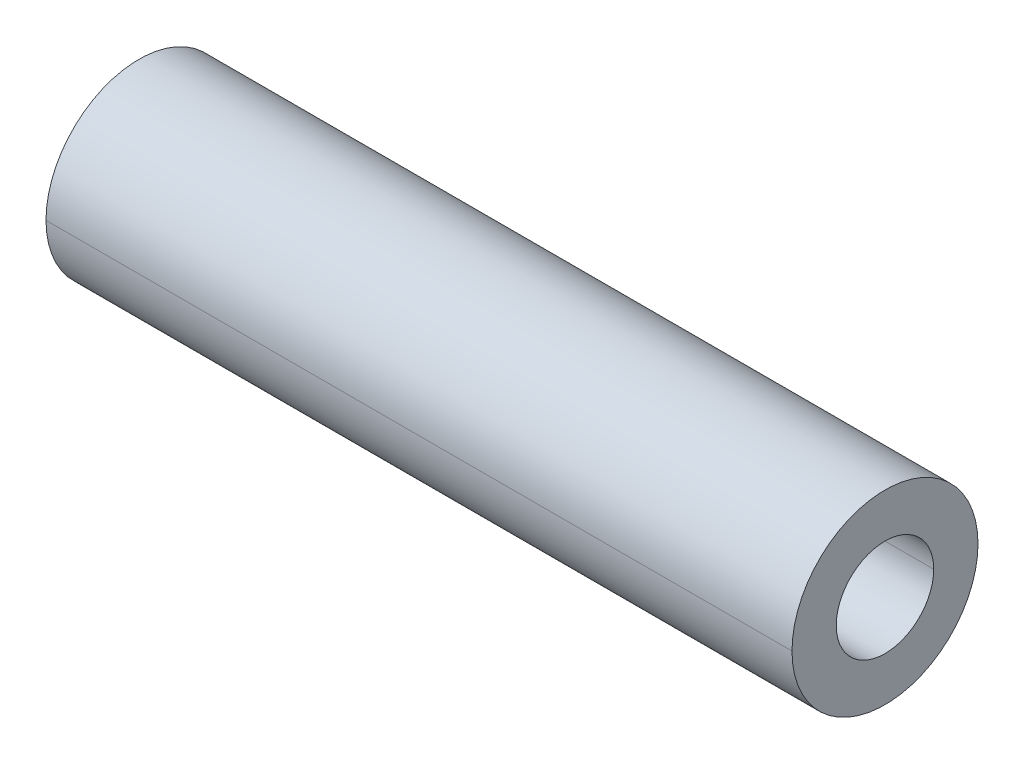
ISO-10303-21;
HEADER;
FILE_DESCRIPTION(('STEP AP214'),'2;1');
FILE_NAME('part.step','',(''),(''),'','','');
FILE_SCHEMA(('AUTOMOTIVE_DESIGN { 1 0 10303 214 1 1 1 1 }'));
ENDSEC;
DATA;
#1=APPLICATION_CONTEXT('core data for automotive mechanical design processes');
#2=APPLICATION_PROTOCOL_DEFINITION('international standard','automotive_design',2000,#1);
#3=PRODUCT_CONTEXT('',#1,'mechanical');
#4=PRODUCT('Part','Part','',(#3));
#5=PRODUCT_RELATED_PRODUCT_CATEGORY('part','',(#4));
#6=PRODUCT_DEFINITION_FORMATION('','',#4);
#7=PRODUCT_DEFINITION_CONTEXT('part definition',#1,'design');
#8=PRODUCT_DEFINITION('design','',#6,#7);
#9=PRODUCT_DEFINITION_SHAPE('','',#8);
#10=(LENGTH_UNIT() NAMED_UNIT(*) SI_UNIT(.MILLI.,.METRE.));
#11=(NAMED_UNIT(*) PLANE_ANGLE_UNIT() SI_UNIT($,.RADIAN.));
#12=(NAMED_UNIT(*) SI_UNIT($,.STERADIAN.) SOLID_ANGLE_UNIT());
#13=UNCERTAINTY_MEASURE_WITH_UNIT(LENGTH_MEASURE(1.E-05),#10,'distance_accuracy_value','');
#14=(GEOMETRIC_REPRESENTATION_CONTEXT(3) GLOBAL_UNCERTAINTY_ASSIGNED_CONTEXT((#13)) GLOBAL_UNIT_ASSIGNED_CONTEXT((#10,
#11,#12)) REPRESENTATION_CONTEXT('',''));
#15=CARTESIAN_POINT('',(0.,0.,0.));
#16=DIRECTION('',(0.,0.,1.));
#17=DIRECTION('',(1.,0.,0.));
#18=AXIS2_PLACEMENT_3D('',#15,#16,#17);
#19=CARTESIAN_POINT('',(19.05,0.,0.));
#20=DIRECTION('',(-1.,0.,0.));
#21=DIRECTION('',(0.,0.,1.));
#22=AXIS2_PLACEMENT_3D('',#19,#20,#21);
#23=CYLINDRICAL_SURFACE('',#22,2.4892);
#24=DIRECTION('',(-1.,0.,0.));
#25=VECTOR('',#24,1.);
#26=CARTESIAN_POINT('',(19.05,0.,-2.4892));
#27=LINE('',#26,#25);
#28=CARTESIAN_POINT('',(19.05,0.,-2.4892));
#29=VERTEX_POINT('',#28);
#30=CARTESIAN_POINT('',(-19.05,0.,-2.4892));
#31=VERTEX_POINT('',#30);
#32=EDGE_CURVE('E105',#29,#31,#27,.T.);
#33=ORIENTED_EDGE('',*,*,#32,.F.);
#34=CARTESIAN_POINT('',(19.05,0.,0.));
#35=DIRECTION('',(1.,0.,0.));
#36=DIRECTION('',(0.,0.,-1.));
#37=AXIS2_PLACEMENT_3D('',#34,#35,#36);
#38=CIRCLE('',#37,2.4892);
#39=CARTESIAN_POINT('',(19.05,0.,2.4892));
#40=VERTEX_POINT('',#39);
#41=EDGE_CURVE('E75',#29,#40,#38,.T.);
#42=ORIENTED_EDGE('',*,*,#41,.T.);
#43=DIRECTION('',(-1.,0.,0.));
#44=VECTOR('',#43,1.);
#45=CARTESIAN_POINT('',(19.05,0.,2.4892));
#46=LINE('',#45,#44);
#47=CARTESIAN_POINT('',(-19.05,0.,2.4892));
#48=VERTEX_POINT('',#47);
#49=EDGE_CURVE('E87',#40,#48,#46,.T.);
#50=ORIENTED_EDGE('',*,*,#49,.T.);
#51=CARTESIAN_POINT('',(-19.05,0.,0.));
#52=DIRECTION('',(1.,0.,0.));
#53=DIRECTION('',(0.,0.,-1.));
#54=AXIS2_PLACEMENT_3D('',#51,#52,#53);
#55=CIRCLE('',#54,2.4892);
#56=EDGE_CURVE('E11',#31,#48,#55,.T.);
#57=ORIENTED_EDGE('',*,*,#56,.F.);
#58=EDGE_LOOP('',(#33,#42,#50,#57));
#59=FACE_BOUND('',#58,.T.);
#60=ADVANCED_FACE('F17',(#59),#23,.F.);
#61=CARTESIAN_POINT('',(19.05,0.,0.));
#62=DIRECTION('',(-1.,0.,0.));
#63=DIRECTION('',(0.,0.,1.));
#64=AXIS2_PLACEMENT_3D('',#61,#62,#63);
#65=CYLINDRICAL_SURFACE('',#64,4.7498);
#66=DIRECTION('',(-1.,0.,0.));
#67=VECTOR('',#66,1.);
#68=CARTESIAN_POINT('',(19.05,0.,-4.7498));
#69=LINE('',#68,#67);
#70=CARTESIAN_POINT('',(19.05,0.,-4.7498));
#71=VERTEX_POINT('',#70);
#72=CARTESIAN_POINT('',(-19.05,0.,-4.7498));
#73=VERTEX_POINT('',#72);
#74=EDGE_CURVE('E79',#71,#73,#69,.T.);
#75=ORIENTED_EDGE('',*,*,#74,.F.);
#76=CARTESIAN_POINT('',(19.05,0.,0.));
#77=DIRECTION('',(1.,0.,0.));
#78=DIRECTION('',(0.,0.,-1.));
#79=AXIS2_PLACEMENT_3D('',#76,#77,#78);
#80=CIRCLE('',#79,4.7498);
#81=CARTESIAN_POINT('',(19.05,0.,4.7498));
#82=VERTEX_POINT('',#81);
#83=EDGE_CURVE('E67',#82,#71,#80,.T.);
#84=ORIENTED_EDGE('',*,*,#83,.F.);
#85=DIRECTION('',(-1.,0.,0.));
#86=VECTOR('',#85,1.);
#87=CARTESIAN_POINT('',(19.05,0.,4.7498));
#88=LINE('',#87,#86);
#89=CARTESIAN_POINT('',(-19.05,0.,4.7498));
#90=VERTEX_POINT('',#89);
#91=EDGE_CURVE('E76',#82,#90,#88,.T.);
#92=ORIENTED_EDGE('',*,*,#91,.T.);
#93=CARTESIAN_POINT('',(-19.05,0.,0.));
#94=DIRECTION('',(1.,0.,0.));
#95=DIRECTION('',(0.,0.,-1.));
#96=AXIS2_PLACEMENT_3D('',#93,#94,#95);
#97=CIRCLE('',#96,4.7498);
#98=EDGE_CURVE('E28',#90,#73,#97,.T.);
#99=ORIENTED_EDGE('',*,*,#98,.T.);
#100=EDGE_LOOP('',(#75,#84,#92,#99));
#101=FACE_BOUND('',#100,.T.);
#102=ADVANCED_FACE('F80',(#101),#65,.T.);
#103=CARTESIAN_POINT('',(-19.05,0.,0.));
#104=DIRECTION('',(1.,0.,0.));
#105=DIRECTION('',(0.,1.,0.));
#106=AXIS2_PLACEMENT_3D('',#103,#104,#105);
#107=PLANE('',#106);
#108=CARTESIAN_POINT('',(-19.05,0.,0.));
#109=DIRECTION('',(1.,0.,0.));
#110=DIRECTION('',(0.,0.,-1.));
#111=AXIS2_PLACEMENT_3D('',#108,#109,#110);
#112=CIRCLE('',#111,2.4892);
#113=EDGE_CURVE('E94',#48,#31,#112,.T.);
#114=ORIENTED_EDGE('',*,*,#113,.T.);
#115=ORIENTED_EDGE('',*,*,#56,.T.);
#116=EDGE_LOOP('',(#114,#115));
#117=FACE_BOUND('',#116,.T.);
#118=ORIENTED_EDGE('',*,*,#98,.F.);
#119=CARTESIAN_POINT('',(-19.05,0.,0.));
#120=DIRECTION('',(1.,0.,0.));
#121=DIRECTION('',(0.,0.,-1.));
#122=AXIS2_PLACEMENT_3D('',#119,#120,#121);
#123=CIRCLE('',#122,4.7498);
#124=EDGE_CURVE('E21',#73,#90,#123,.T.);
#125=ORIENTED_EDGE('',*,*,#124,.F.);
#126=EDGE_LOOP('',(#118,#125));
#127=FACE_BOUND('',#126,.T.);
#128=ADVANCED_FACE('F127',(#117,#127),#107,.F.);
#129=CARTESIAN_POINT('',(19.05,0.,0.));
#130=DIRECTION('',(1.,0.,0.));
#131=DIRECTION('',(0.,1.,0.));
#132=AXIS2_PLACEMENT_3D('',#129,#130,#131);
#133=PLANE('',#132);
#134=CARTESIAN_POINT('',(19.05,0.,0.));
#135=DIRECTION('',(1.,0.,0.));
#136=DIRECTION('',(0.,0.,-1.));
#137=AXIS2_PLACEMENT_3D('',#134,#135,#136);
#138=CIRCLE('',#137,2.4892);
#139=EDGE_CURVE('E112',#40,#29,#138,.T.);
#140=ORIENTED_EDGE('',*,*,#139,.F.);
#141=ORIENTED_EDGE('',*,*,#41,.F.);
#142=EDGE_LOOP('',(#140,#141));
#143=FACE_BOUND('',#142,.T.);
#144=ORIENTED_EDGE('',*,*,#83,.T.);
#145=CARTESIAN_POINT('',(19.05,0.,0.));
#146=DIRECTION('',(1.,0.,0.));
#147=DIRECTION('',(0.,0.,-1.));
#148=AXIS2_PLACEMENT_3D('',#145,#146,#147);
#149=CIRCLE('',#148,4.7498);
#150=EDGE_CURVE('E71',#71,#82,#149,.T.);
#151=ORIENTED_EDGE('',*,*,#150,.T.);
#152=EDGE_LOOP('',(#144,#151));
#153=FACE_BOUND('',#152,.T.);
#154=ADVANCED_FACE('F69',(#143,#153),#133,.T.);
#155=CARTESIAN_POINT('',(19.05,0.,0.));
#156=DIRECTION('',(-1.,0.,0.));
#157=DIRECTION('',(0.,0.,1.));
#158=AXIS2_PLACEMENT_3D('',#155,#156,#157);
#159=CYLINDRICAL_SURFACE('',#158,4.7498);
#160=ORIENTED_EDGE('',*,*,#150,.F.);
#161=ORIENTED_EDGE('',*,*,#74,.T.);
#162=ORIENTED_EDGE('',*,*,#124,.T.);
#163=ORIENTED_EDGE('',*,*,#91,.F.);
#164=EDGE_LOOP('',(#160,#161,#162,#163));
#165=FACE_BOUND('',#164,.T.);
#166=ADVANCED_FACE('F85',(#165),#159,.T.);
#167=CARTESIAN_POINT('',(19.05,0.,0.));
#168=DIRECTION('',(-1.,0.,0.));
#169=DIRECTION('',(0.,0.,1.));
#170=AXIS2_PLACEMENT_3D('',#167,#168,#169);
#171=CYLINDRICAL_SURFACE('',#170,2.4892);
#172=ORIENTED_EDGE('',*,*,#139,.T.);
#173=ORIENTED_EDGE('',*,*,#32,.T.);
#174=ORIENTED_EDGE('',*,*,#113,.F.);
#175=ORIENTED_EDGE('',*,*,#49,.F.);
#176=EDGE_LOOP('',(#172,#173,#174,#175));
#177=FACE_BOUND('',#176,.T.);
#178=ADVANCED_FACE('F19',(#177),#171,.F.);
#179=CLOSED_SHELL('',(#60,#102,#128,#154,#166,#178));
#180=MANIFOLD_SOLID_BREP('B1',#179);
#181=ADVANCED_BREP_SHAPE_REPRESENTATION('',(#18,#180),#14);
#182=SHAPE_DEFINITION_REPRESENTATION(#9,#181);
ENDSEC;
END-ISO-10303-21;
